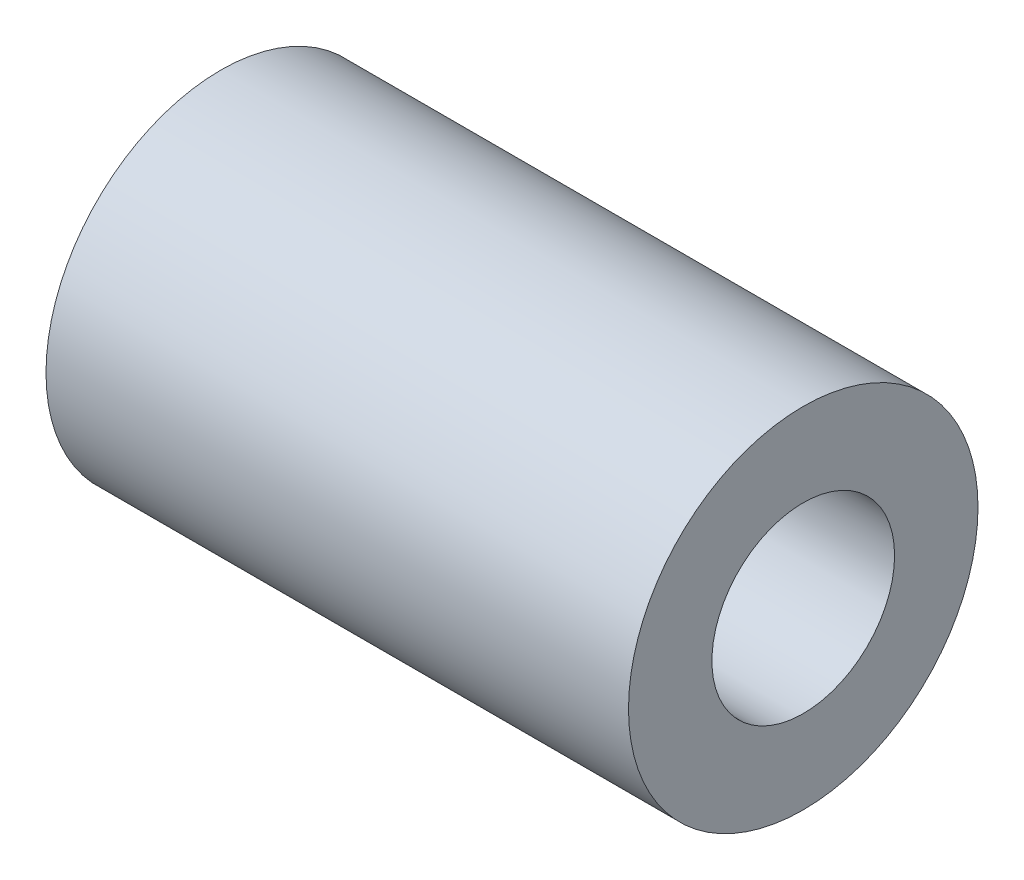
ISO-10303-21;
HEADER;
FILE_DESCRIPTION(('STEP AP214'),'2;1');
FILE_NAME('part.step','',(''),(''),'','','');
FILE_SCHEMA(('AUTOMOTIVE_DESIGN { 1 0 10303 214 1 1 1 1 }'));
ENDSEC;
DATA;
#1=APPLICATION_CONTEXT('core data for automotive mechanical design processes');
#2=APPLICATION_PROTOCOL_DEFINITION('international standard','automotive_design',2000,#1);
#3=PRODUCT_CONTEXT('',#1,'mechanical');
#4=PRODUCT('Part','Part','',(#3));
#5=PRODUCT_RELATED_PRODUCT_CATEGORY('part','',(#4));
#6=PRODUCT_DEFINITION_FORMATION('','',#4);
#7=PRODUCT_DEFINITION_CONTEXT('part definition',#1,'design');
#8=PRODUCT_DEFINITION('design','',#6,#7);
#9=PRODUCT_DEFINITION_SHAPE('','',#8);
#10=(LENGTH_UNIT() NAMED_UNIT(*) SI_UNIT(.MILLI.,.METRE.));
#11=(NAMED_UNIT(*) PLANE_ANGLE_UNIT() SI_UNIT($,.RADIAN.));
#12=(NAMED_UNIT(*) SI_UNIT($,.STERADIAN.) SOLID_ANGLE_UNIT());
#13=UNCERTAINTY_MEASURE_WITH_UNIT(LENGTH_MEASURE(1.E-05),#10,'distance_accuracy_value','');
#14=(GEOMETRIC_REPRESENTATION_CONTEXT(3) GLOBAL_UNCERTAINTY_ASSIGNED_CONTEXT((#13)) GLOBAL_UNIT_ASSIGNED_CONTEXT((#10,
#11,#12)) REPRESENTATION_CONTEXT('',''));
#15=CARTESIAN_POINT('',(0.,0.,0.));
#16=DIRECTION('',(0.,0.,1.));
#17=DIRECTION('',(1.,0.,0.));
#18=AXIS2_PLACEMENT_3D('',#15,#16,#17);
#19=CARTESIAN_POINT('',(15.875,0.,0.));
#20=DIRECTION('',(1.,0.,0.));
#21=DIRECTION('',(0.,0.,-1.));
#22=AXIS2_PLACEMENT_3D('',#19,#20,#21);
#23=PLANE('',#22);
#24=CARTESIAN_POINT('',(15.875,0.,0.));
#25=DIRECTION('',(1.,0.,0.));
#26=DIRECTION('',(0.,0.,-1.));
#27=AXIS2_PLACEMENT_3D('',#24,#25,#26);
#28=CIRCLE('',#27,4.7625);
#29=CARTESIAN_POINT('',(15.875,0.,-4.7625));
#30=VERTEX_POINT('',#29);
#31=EDGE_CURVE('E10',#30,#30,#28,.T.);
#32=ORIENTED_EDGE('',*,*,#31,.T.);
#33=EDGE_LOOP('',(#32));
#34=FACE_BOUND('',#33,.T.);
#35=CARTESIAN_POINT('',(15.875,0.,0.));
#36=DIRECTION('',(1.,0.,0.));
#37=DIRECTION('',(0.,0.,-1.));
#38=AXIS2_PLACEMENT_3D('',#35,#36,#37);
#39=CIRCLE('',#38,2.4892);
#40=CARTESIAN_POINT('',(15.875,0.,-2.4892));
#41=VERTEX_POINT('',#40);
#42=EDGE_CURVE('E44',#41,#41,#39,.T.);
#43=ORIENTED_EDGE('',*,*,#42,.F.);
#44=EDGE_LOOP('',(#43));
#45=FACE_BOUND('',#44,.T.);
#46=ADVANCED_FACE('F33',(#34,#45),#23,.T.);
#47=CARTESIAN_POINT('',(0.,0.,0.));
#48=DIRECTION('',(1.,0.,0.));
#49=DIRECTION('',(0.,0.,-1.));
#50=AXIS2_PLACEMENT_3D('',#47,#48,#49);
#51=PLANE('',#50);
#52=CARTESIAN_POINT('',(0.,0.,0.));
#53=DIRECTION('',(1.,0.,0.));
#54=DIRECTION('',(0.,0.,-1.));
#55=AXIS2_PLACEMENT_3D('',#52,#53,#54);
#56=CIRCLE('',#55,4.7625);
#57=CARTESIAN_POINT('',(0.,0.,-4.7625));
#58=VERTEX_POINT('',#57);
#59=EDGE_CURVE('E37',#58,#58,#56,.T.);
#60=ORIENTED_EDGE('',*,*,#59,.F.);
#61=EDGE_LOOP('',(#60));
#62=FACE_BOUND('',#61,.T.);
#63=CARTESIAN_POINT('',(0.,0.,0.));
#64=DIRECTION('',(1.,0.,0.));
#65=DIRECTION('',(0.,0.,-1.));
#66=AXIS2_PLACEMENT_3D('',#63,#64,#65);
#67=CIRCLE('',#66,2.4892);
#68=CARTESIAN_POINT('',(0.,0.,-2.4892));
#69=VERTEX_POINT('',#68);
#70=EDGE_CURVE('E46',#69,#69,#67,.T.);
#71=ORIENTED_EDGE('',*,*,#70,.T.);
#72=EDGE_LOOP('',(#71));
#73=FACE_BOUND('',#72,.T.);
#74=ADVANCED_FACE('F56',(#62,#73),#51,.F.);
#75=CARTESIAN_POINT('',(15.875,0.,0.));
#76=DIRECTION('',(-1.,0.,0.));
#77=DIRECTION('',(0.,0.,1.));
#78=AXIS2_PLACEMENT_3D('',#75,#76,#77);
#79=CYLINDRICAL_SURFACE('',#78,4.7625);
#80=ORIENTED_EDGE('',*,*,#31,.F.);
#81=EDGE_LOOP('',(#80));
#82=FACE_BOUND('',#81,.T.);
#83=ORIENTED_EDGE('',*,*,#59,.T.);
#84=EDGE_LOOP('',(#83));
#85=FACE_BOUND('',#84,.T.);
#86=ADVANCED_FACE('F35',(#82,#85),#79,.T.);
#87=CARTESIAN_POINT('',(15.875,0.,0.));
#88=DIRECTION('',(-1.,0.,0.));
#89=DIRECTION('',(0.,0.,1.));
#90=AXIS2_PLACEMENT_3D('',#87,#88,#89);
#91=CYLINDRICAL_SURFACE('',#90,2.4892);
#92=ORIENTED_EDGE('',*,*,#42,.T.);
#93=EDGE_LOOP('',(#92));
#94=FACE_BOUND('',#93,.T.);
#95=ORIENTED_EDGE('',*,*,#70,.F.);
#96=EDGE_LOOP('',(#95));
#97=FACE_BOUND('',#96,.T.);
#98=ADVANCED_FACE('F52',(#94,#97),#91,.F.);
#99=CLOSED_SHELL('',(#46,#74,#86,#98));
#100=MANIFOLD_SOLID_BREP('B2',#99);
#101=ADVANCED_BREP_SHAPE_REPRESENTATION('',(#18,#100),#14);
#102=SHAPE_DEFINITION_REPRESENTATION(#9,#101);
ENDSEC;
END-ISO-10303-21;
